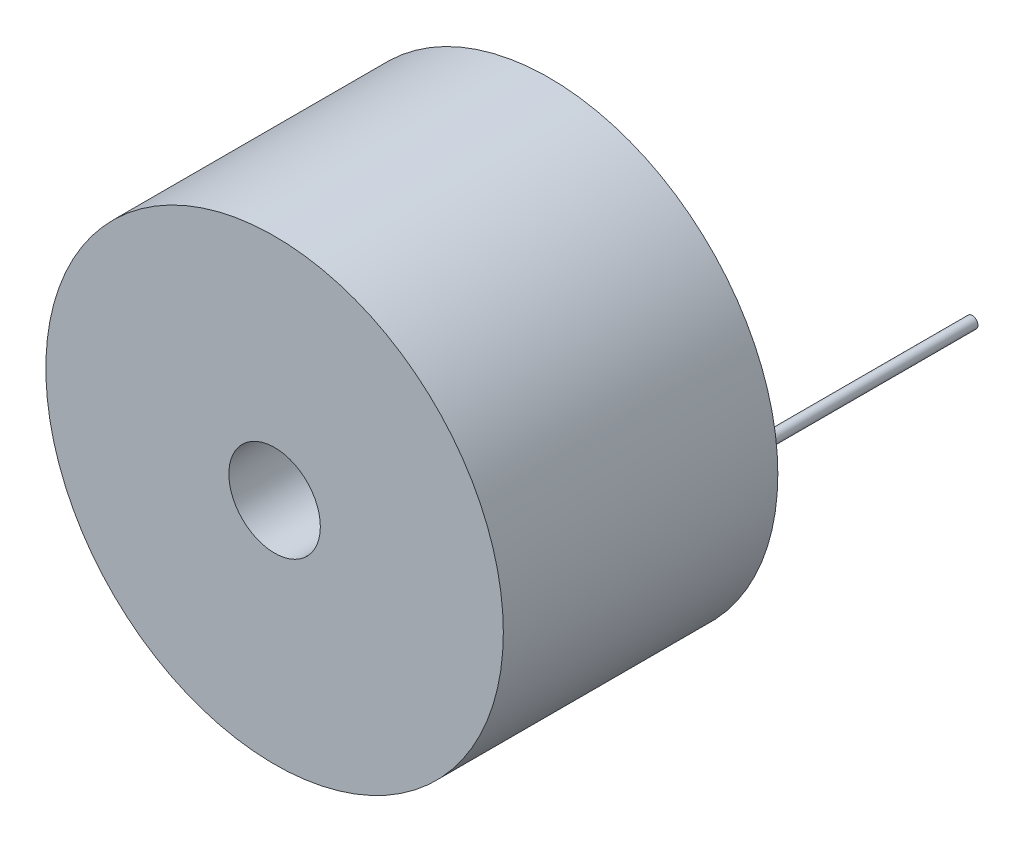
ISO-10303-21;
HEADER;
FILE_DESCRIPTION(('STEP AP214'),'2;1');
FILE_NAME('part.step','',(''),(''),'','','');
FILE_SCHEMA(('AUTOMOTIVE_DESIGN { 1 0 10303 214 1 1 1 1 }'));
ENDSEC;
DATA;
#1=APPLICATION_CONTEXT('core data for automotive mechanical design processes');
#2=APPLICATION_PROTOCOL_DEFINITION('international standard','automotive_design',2000,#1);
#3=PRODUCT_CONTEXT('',#1,'mechanical');
#4=PRODUCT('Part','Part','',(#3));
#5=PRODUCT_RELATED_PRODUCT_CATEGORY('part','',(#4));
#6=PRODUCT_DEFINITION_FORMATION('','',#4);
#7=PRODUCT_DEFINITION_CONTEXT('part definition',#1,'design');
#8=PRODUCT_DEFINITION('design','',#6,#7);
#9=PRODUCT_DEFINITION_SHAPE('','',#8);
#10=(LENGTH_UNIT() NAMED_UNIT(*) SI_UNIT(.MILLI.,.METRE.));
#11=(NAMED_UNIT(*) PLANE_ANGLE_UNIT() SI_UNIT($,.RADIAN.));
#12=(NAMED_UNIT(*) SI_UNIT($,.STERADIAN.) SOLID_ANGLE_UNIT());
#13=UNCERTAINTY_MEASURE_WITH_UNIT(LENGTH_MEASURE(1.E-05),#10,'distance_accuracy_value','');
#14=(GEOMETRIC_REPRESENTATION_CONTEXT(3) GLOBAL_UNCERTAINTY_ASSIGNED_CONTEXT((#13)) GLOBAL_UNIT_ASSIGNED_CONTEXT((#10,
#11,#12)) REPRESENTATION_CONTEXT('',''));
#15=CARTESIAN_POINT('',(0.,0.,0.));
#16=DIRECTION('',(0.,0.,1.));
#17=DIRECTION('',(1.,0.,0.));
#18=AXIS2_PLACEMENT_3D('',#15,#16,#17);
#19=CARTESIAN_POINT('',(0.,0.,12.));
#20=DIRECTION('',(0.,0.,-1.));
#21=DIRECTION('',(-1.,0.,0.));
#22=AXIS2_PLACEMENT_3D('',#19,#20,#21);
#23=CYLINDRICAL_SURFACE('',#22,10.);
#24=CARTESIAN_POINT('',(0.,0.,12.));
#25=DIRECTION('',(0.,0.,1.));
#26=DIRECTION('',(1.,0.,0.));
#27=AXIS2_PLACEMENT_3D('',#24,#25,#26);
#28=CIRCLE('',#27,10.);
#29=CARTESIAN_POINT('',(10.,0.,12.));
#30=VERTEX_POINT('',#29);
#31=EDGE_CURVE('E53',#30,#30,#28,.T.);
#32=ORIENTED_EDGE('',*,*,#31,.F.);
#33=EDGE_LOOP('',(#32));
#34=FACE_BOUND('',#33,.T.);
#35=CARTESIAN_POINT('',(0.,0.,0.));
#36=DIRECTION('',(0.,0.,1.));
#37=DIRECTION('',(1.,0.,0.));
#38=AXIS2_PLACEMENT_3D('',#35,#36,#37);
#39=CIRCLE('',#38,10.);
#40=CARTESIAN_POINT('',(10.,0.,0.));
#41=VERTEX_POINT('',#40);
#42=EDGE_CURVE('E58',#41,#41,#39,.T.);
#43=ORIENTED_EDGE('',*,*,#42,.T.);
#44=EDGE_LOOP('',(#43));
#45=FACE_BOUND('',#44,.T.);
#46=ADVANCED_FACE('F41',(#34,#45),#23,.T.);
#47=CARTESIAN_POINT('',(0.,0.,12.));
#48=DIRECTION('',(0.,0.,1.));
#49=DIRECTION('',(1.,0.,0.));
#50=AXIS2_PLACEMENT_3D('',#47,#48,#49);
#51=PLANE('',#50);
#52=CARTESIAN_POINT('',(0.,0.,12.));
#53=DIRECTION('',(0.,0.,1.));
#54=DIRECTION('',(1.,0.,0.));
#55=AXIS2_PLACEMENT_3D('',#52,#53,#54);
#56=CIRCLE('',#55,2.);
#57=CARTESIAN_POINT('',(2.,0.,12.));
#58=VERTEX_POINT('',#57);
#59=EDGE_CURVE('E65',#58,#58,#56,.T.);
#60=ORIENTED_EDGE('',*,*,#59,.F.);
#61=EDGE_LOOP('',(#60));
#62=FACE_BOUND('',#61,.T.);
#63=ORIENTED_EDGE('',*,*,#31,.T.);
#64=EDGE_LOOP('',(#63));
#65=FACE_BOUND('',#64,.T.);
#66=ADVANCED_FACE('F96',(#62,#65),#51,.T.);
#67=CARTESIAN_POINT('',(0.,0.,0.));
#68=DIRECTION('',(0.,0.,1.));
#69=DIRECTION('',(1.,0.,0.));
#70=AXIS2_PLACEMENT_3D('',#67,#68,#69);
#71=PLANE('',#70);
#72=CARTESIAN_POINT('',(-8.5,0.,0.));
#73=DIRECTION('',(0.,0.,1.));
#74=DIRECTION('',(1.,0.,0.));
#75=AXIS2_PLACEMENT_3D('',#72,#73,#74);
#76=CIRCLE('',#75,0.25);
#77=CARTESIAN_POINT('',(-8.25,0.,0.));
#78=VERTEX_POINT('',#77);
#79=EDGE_CURVE('E10',#78,#78,#76,.F.);
#80=ORIENTED_EDGE('',*,*,#79,.F.);
#81=EDGE_LOOP('',(#80));
#82=FACE_BOUND('',#81,.T.);
#83=CARTESIAN_POINT('',(8.5,0.,0.));
#84=DIRECTION('',(0.,0.,1.));
#85=DIRECTION('',(1.,0.,0.));
#86=AXIS2_PLACEMENT_3D('',#83,#84,#85);
#87=CIRCLE('',#86,0.25);
#88=CARTESIAN_POINT('',(8.75,0.,0.));
#89=VERTEX_POINT('',#88);
#90=EDGE_CURVE('E48',#89,#89,#87,.F.);
#91=ORIENTED_EDGE('',*,*,#90,.F.);
#92=EDGE_LOOP('',(#91));
#93=FACE_BOUND('',#92,.T.);
#94=ORIENTED_EDGE('',*,*,#42,.F.);
#95=EDGE_LOOP('',(#94));
#96=FACE_BOUND('',#95,.T.);
#97=ADVANCED_FACE('F101',(#82,#93,#96),#71,.F.);
#98=CARTESIAN_POINT('',(0.,0.,2.));
#99=DIRECTION('',(0.,0.,1.));
#100=DIRECTION('',(1.,0.,0.));
#101=AXIS2_PLACEMENT_3D('',#98,#99,#100);
#102=CYLINDRICAL_SURFACE('',#101,2.);
#103=CARTESIAN_POINT('',(0.,0.,2.));
#104=DIRECTION('',(0.,0.,1.));
#105=DIRECTION('',(1.,0.,0.));
#106=AXIS2_PLACEMENT_3D('',#103,#104,#105);
#107=CIRCLE('',#106,2.);
#108=CARTESIAN_POINT('',(2.,0.,2.));
#109=VERTEX_POINT('',#108);
#110=EDGE_CURVE('E63',#109,#109,#107,.T.);
#111=ORIENTED_EDGE('',*,*,#110,.F.);
#112=EDGE_LOOP('',(#111));
#113=FACE_BOUND('',#112,.T.);
#114=ORIENTED_EDGE('',*,*,#59,.T.);
#115=EDGE_LOOP('',(#114));
#116=FACE_BOUND('',#115,.T.);
#117=ADVANCED_FACE('F109',(#113,#116),#102,.F.);
#118=CARTESIAN_POINT('',(0.,0.,2.));
#119=DIRECTION('',(0.,0.,1.));
#120=DIRECTION('',(1.,0.,0.));
#121=AXIS2_PLACEMENT_3D('',#118,#119,#120);
#122=PLANE('',#121);
#123=ORIENTED_EDGE('',*,*,#110,.T.);
#124=EDGE_LOOP('',(#123));
#125=FACE_BOUND('',#124,.T.);
#126=ADVANCED_FACE('F114',(#125),#122,.T.);
#127=CARTESIAN_POINT('',(8.5,0.,-10.));
#128=DIRECTION('',(0.,0.,1.));
#129=DIRECTION('',(1.,0.,0.));
#130=AXIS2_PLACEMENT_3D('',#127,#128,#129);
#131=CYLINDRICAL_SURFACE('',#130,0.25);
#132=CARTESIAN_POINT('',(8.5,0.,-10.));
#133=DIRECTION('',(0.,0.,-1.));
#134=DIRECTION('',(-1.,0.,0.));
#135=AXIS2_PLACEMENT_3D('',#132,#133,#134);
#136=CIRCLE('',#135,0.25);
#137=CARTESIAN_POINT('',(8.25,0.,-10.));
#138=VERTEX_POINT('',#137);
#139=EDGE_CURVE('E69',#138,#138,#136,.T.);
#140=ORIENTED_EDGE('',*,*,#139,.F.);
#141=EDGE_LOOP('',(#140));
#142=FACE_BOUND('',#141,.T.);
#143=ORIENTED_EDGE('',*,*,#90,.T.);
#144=EDGE_LOOP('',(#143));
#145=FACE_BOUND('',#144,.T.);
#146=ADVANCED_FACE('F92',(#142,#145),#131,.T.);
#147=CARTESIAN_POINT('',(0.,0.,-10.));
#148=DIRECTION('',(0.,0.,-1.));
#149=DIRECTION('',(-1.,0.,0.));
#150=AXIS2_PLACEMENT_3D('',#147,#148,#149);
#151=PLANE('',#150);
#152=ORIENTED_EDGE('',*,*,#139,.T.);
#153=EDGE_LOOP('',(#152));
#154=FACE_BOUND('',#153,.T.);
#155=ADVANCED_FACE('F85',(#154),#151,.T.);
#156=CARTESIAN_POINT('',(-8.5,0.,-8.));
#157=DIRECTION('',(0.,0.,1.));
#158=DIRECTION('',(1.,0.,0.));
#159=AXIS2_PLACEMENT_3D('',#156,#157,#158);
#160=CYLINDRICAL_SURFACE('',#159,0.25);
#161=CARTESIAN_POINT('',(-8.5,0.,-8.));
#162=DIRECTION('',(0.,0.,-1.));
#163=DIRECTION('',(-1.,0.,0.));
#164=AXIS2_PLACEMENT_3D('',#161,#162,#163);
#165=CIRCLE('',#164,0.25);
#166=CARTESIAN_POINT('',(-8.75,0.,-8.));
#167=VERTEX_POINT('',#166);
#168=EDGE_CURVE('E76',#167,#167,#165,.T.);
#169=ORIENTED_EDGE('',*,*,#168,.F.);
#170=EDGE_LOOP('',(#169));
#171=FACE_BOUND('',#170,.T.);
#172=ORIENTED_EDGE('',*,*,#79,.T.);
#173=EDGE_LOOP('',(#172));
#174=FACE_BOUND('',#173,.T.);
#175=ADVANCED_FACE('F83',(#171,#174),#160,.T.);
#176=CARTESIAN_POINT('',(0.,0.,-8.));
#177=DIRECTION('',(0.,0.,-1.));
#178=DIRECTION('',(-1.,0.,0.));
#179=AXIS2_PLACEMENT_3D('',#176,#177,#178);
#180=PLANE('',#179);
#181=ORIENTED_EDGE('',*,*,#168,.T.);
#182=EDGE_LOOP('',(#181));
#183=FACE_BOUND('',#182,.T.);
#184=ADVANCED_FACE('F81',(#183),#180,.T.);
#185=CLOSED_SHELL('',(#46,#66,#97,#117,#126,#146,#155,#175,#184));
#186=MANIFOLD_SOLID_BREP('B2',#185);
#187=ADVANCED_BREP_SHAPE_REPRESENTATION('',(#18,#186),#14);
#188=SHAPE_DEFINITION_REPRESENTATION(#9,#187);
ENDSEC;
END-ISO-10303-21;
